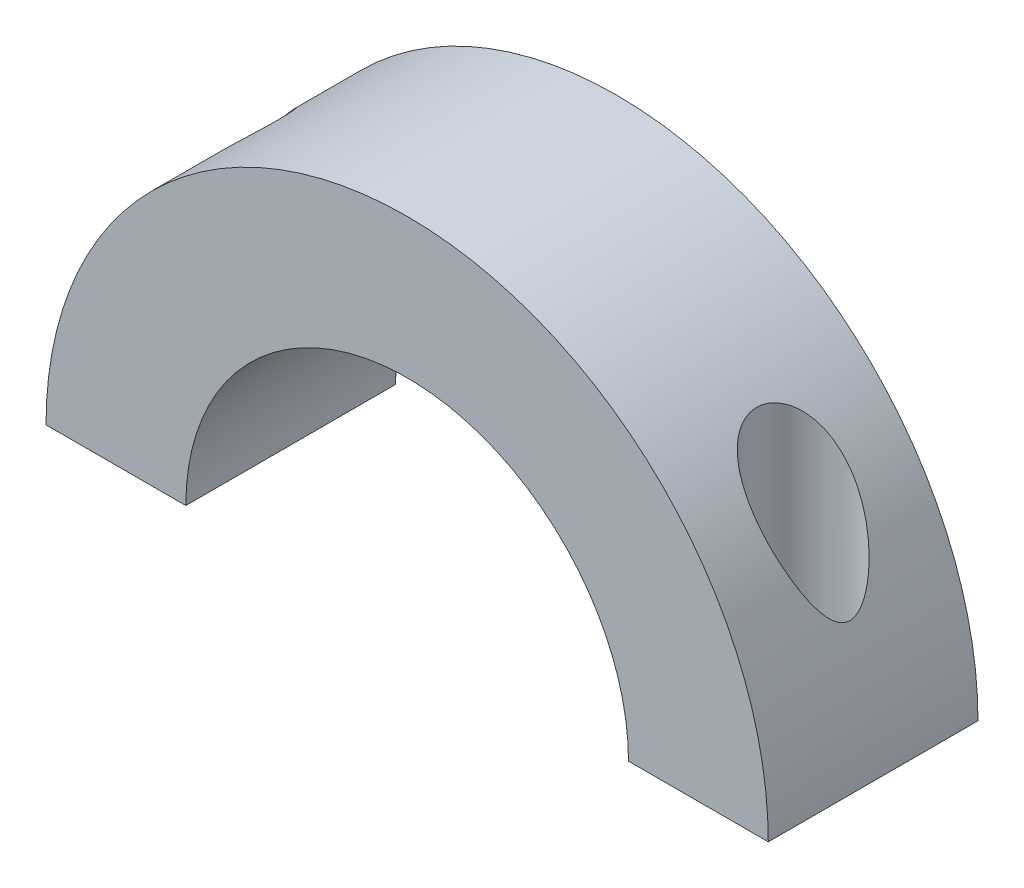
ISO-10303-21;
HEADER;
FILE_DESCRIPTION(('STEP AP214'),'2;1');
FILE_NAME('part.step','',(''),(''),'','','');
FILE_SCHEMA(('AUTOMOTIVE_DESIGN { 1 0 10303 214 1 1 1 1 }'));
ENDSEC;
DATA;
#1=APPLICATION_CONTEXT('core data for automotive mechanical design processes');
#2=APPLICATION_PROTOCOL_DEFINITION('international standard','automotive_design',2000,#1);
#3=PRODUCT_CONTEXT('',#1,'mechanical');
#4=PRODUCT('Part','Part','',(#3));
#5=PRODUCT_RELATED_PRODUCT_CATEGORY('part','',(#4));
#6=PRODUCT_DEFINITION_FORMATION('','',#4);
#7=PRODUCT_DEFINITION_CONTEXT('part definition',#1,'design');
#8=PRODUCT_DEFINITION('design','',#6,#7);
#9=PRODUCT_DEFINITION_SHAPE('','',#8);
#10=(LENGTH_UNIT() NAMED_UNIT(*) SI_UNIT(.MILLI.,.METRE.));
#11=(NAMED_UNIT(*) PLANE_ANGLE_UNIT() SI_UNIT($,.RADIAN.));
#12=(NAMED_UNIT(*) SI_UNIT($,.STERADIAN.) SOLID_ANGLE_UNIT());
#13=UNCERTAINTY_MEASURE_WITH_UNIT(LENGTH_MEASURE(1.E-05),#10,'distance_accuracy_value','');
#14=(GEOMETRIC_REPRESENTATION_CONTEXT(3) GLOBAL_UNCERTAINTY_ASSIGNED_CONTEXT((#13)) GLOBAL_UNIT_ASSIGNED_CONTEXT((#10,
#11,#12)) REPRESENTATION_CONTEXT('',''));
#15=CARTESIAN_POINT('',(0.,0.,0.));
#16=DIRECTION('',(0.,0.,1.));
#17=DIRECTION('',(1.,0.,0.));
#18=AXIS2_PLACEMENT_3D('',#15,#16,#17);
#19=CARTESIAN_POINT('',(0.,0.,18.));
#20=DIRECTION('',(0.,0.,-1.));
#21=DIRECTION('',(-1.,0.,0.));
#22=AXIS2_PLACEMENT_3D('',#19,#20,#21);
#23=CYLINDRICAL_SURFACE('',#22,31.);
#24=CARTESIAN_POINT('',(25.,18.3303027798234,5.));
#25=CARTESIAN_POINT('',(24.8440725378242,18.5429648104186,4.99999834693672));
#26=CARTESIAN_POINT('',(24.6853946071166,18.7536793176195,5.00910047007202));
#27=CARTESIAN_POINT('',(24.3635103532747,19.1699930019949,5.04763708695558));
#28=CARTESIAN_POINT('',(24.2003012248089,19.3755888537004,5.07708445890284));
#29=CARTESIAN_POINT('',(23.8712055274805,19.7796181922859,5.15883711268822));
#30=CARTESIAN_POINT('',(23.7053230027018,19.9780612525745,5.21111051308694));
#31=CARTESIAN_POINT('',(23.3731361141481,20.3656952329873,5.34143361783125));
#32=CARTESIAN_POINT('',(23.20683242597,20.5548962115987,5.41945454876341));
#33=CARTESIAN_POINT('',(22.8732083649563,20.9255795596352,5.60674166231151));
#34=CARTESIAN_POINT('',(22.7059526470021,21.1067841553644,5.71668547931498));
#35=CARTESIAN_POINT('',(22.3798764915757,21.4522103271162,5.97055561693543));
#36=CARTESIAN_POINT('',(22.2210449776457,21.6164544868569,6.1144358880528));
#37=CARTESIAN_POINT('',(21.9452834326933,21.8960348704812,6.41110341200045));
#38=CARTESIAN_POINT('',(21.8258350033741,22.0149303032896,6.55814933200775));
#39=CARTESIAN_POINT('',(21.6038806922158,22.2327791824141,6.87771171453206));
#40=CARTESIAN_POINT('',(21.5013555276024,22.3317553538167,7.05019875832245));
#41=CARTESIAN_POINT('',(21.3368258786018,22.488895074806,7.38471819177052));
#42=CARTESIAN_POINT('',(21.270834643445,22.5512204486291,7.54279461990126));
#43=CARTESIAN_POINT('',(21.1865840167894,22.6302923713222,7.7894453392909));
#44=CARTESIAN_POINT('',(21.1609508830841,22.6542521518156,7.87327891385435));
#45=CARTESIAN_POINT('',(21.1150084125697,22.6970793130105,8.04364758569689));
#46=CARTESIAN_POINT('',(21.0946968904875,22.7159487840975,8.13018155769337));
#47=CARTESIAN_POINT('',(21.0596650556057,22.7484303379167,8.30586070876304));
#48=CARTESIAN_POINT('',(21.0449763328409,22.7620127237202,8.39501769559748));
#49=CARTESIAN_POINT('',(21.0216368718112,22.7835694275095,8.57475225392739));
#50=CARTESIAN_POINT('',(21.01298352055,22.7915461724524,8.66532919326984));
#51=CARTESIAN_POINT('',(21.0018824398915,22.8017761272689,8.84719324817007));
#52=CARTESIAN_POINT('',(20.9994348123468,22.8040292432025,8.93848037535928));
#53=CARTESIAN_POINT('',(21.0007858657793,22.8027845349241,9.12094015222018));
#54=CARTESIAN_POINT('',(21.0045841419976,22.7992870833713,9.21211280892683));
#55=CARTESIAN_POINT('',(21.0241050532095,22.7812944617046,9.46892702003491));
#56=CARTESIAN_POINT('',(21.0471026480896,22.7600857772158,9.63364573545759));
#57=CARTESIAN_POINT('',(21.1123462585095,22.6995762098303,9.95561779082682));
#58=CARTESIAN_POINT('',(21.154592670378,22.6602749544117,10.1128709769863));
#59=CARTESIAN_POINT('',(21.2574047297385,22.5638610674473,10.4213430301116));
#60=CARTESIAN_POINT('',(21.3184984613775,22.5062332813956,10.572222921513));
#61=CARTESIAN_POINT('',(21.4552480430574,22.3759080444386,10.860161159053));
#62=CARTESIAN_POINT('',(21.5309112354643,22.3032029938288,10.9972124829047));
#63=CARTESIAN_POINT('',(21.7297051832038,22.1098749276034,11.3138538549968));
#64=CARTESIAN_POINT('',(21.8590029033316,21.9823029536339,11.4853426966256));
#65=CARTESIAN_POINT('',(22.1328165343368,21.7065952111084,11.7968696309203));
#66=CARTESIAN_POINT('',(22.2773639279527,21.5584166918757,11.9368407130362));
#67=CARTESIAN_POINT('',(22.5307469724867,21.2929216132307,12.1498349397655));
#68=CARTESIAN_POINT('',(22.6374598889793,21.179485498508,12.2304017610675));
#69=CARTESIAN_POINT('',(22.8534432528734,20.9462516628356,12.3777784364227));
#70=CARTESIAN_POINT('',(22.9627146983173,20.8264514354203,12.4445828189363));
#71=CARTESIAN_POINT('',(23.292428719303,20.4589970951531,12.6259109363354));
#72=CARTESIAN_POINT('',(23.5146885786972,20.2033750860338,12.7212837386909));
#73=CARTESIAN_POINT('',(23.9012495822696,19.7432855535363,12.8501070256378));
#74=CARTESIAN_POINT('',(24.0662577380225,19.5418489791005,12.8930475631604));
#75=CARTESIAN_POINT('',(24.392835276003,19.1326426677742,12.957150246706));
#76=CARTESIAN_POINT('',(24.5544029025615,18.9248698231181,12.9783015228917));
#77=CARTESIAN_POINT('',(24.8729512469319,18.5042186285861,13.0011769604055));
#78=CARTESIAN_POINT('',(25.0299220850632,18.2913308501605,13.0028619607851));
#79=CARTESIAN_POINT('',(25.3380524077325,17.8620527465157,12.9886707316841));
#80=CARTESIAN_POINT('',(25.4892124252819,17.6456627451462,12.9727961168973));
#81=CARTESIAN_POINT('',(25.8422296054431,17.1263561644747,12.91584291103));
#82=CARTESIAN_POINT('',(26.0411640175139,16.8222444985086,12.8674068112365));
#83=CARTESIAN_POINT('',(26.4258526443899,16.2112561150447,12.7427067761913));
#84=CARTESIAN_POINT('',(26.61159862285,15.9043778022229,12.6664256308028));
#85=CARTESIAN_POINT('',(26.9692661215757,15.2900276762251,12.4874130401547));
#86=CARTESIAN_POINT('',(27.1411818469765,14.9825556689762,12.3846705826004));
#87=CARTESIAN_POINT('',(27.3880367848129,14.5232813526927,12.2105102505075));
#88=CARTESIAN_POINT('',(27.4684665620087,14.3705501961828,12.1491335738614));
#89=CARTESIAN_POINT('',(27.6255832033342,14.0661458225791,12.0193878849399));
#90=CARTESIAN_POINT('',(27.7022706096807,13.9144724549722,11.9510198900777));
#91=CARTESIAN_POINT('',(27.850414686708,13.6154960433898,11.8081197580309));
#92=CARTESIAN_POINT('',(27.9219409000418,13.4681635816617,11.7337215543157));
#93=CARTESIAN_POINT('',(28.0610732389327,13.1758250070044,11.5769791358607));
#94=CARTESIAN_POINT('',(28.1286786266117,13.0308193356547,11.4946334331632));
#95=CARTESIAN_POINT('',(28.2593552135961,12.7449374941101,11.321280168168));
#96=CARTESIAN_POINT('',(28.3224448831377,12.6040460857226,11.2303119044256));
#97=CARTESIAN_POINT('',(28.4438663120481,12.327578678461,11.0378297024099));
#98=CARTESIAN_POINT('',(28.5022017083338,12.1919986585167,10.9363239628477));
#99=CARTESIAN_POINT('',(28.6006113784826,11.9589801465672,10.7448192374628));
#100=CARTESIAN_POINT('',(28.6418224364718,11.8598770194585,10.6574493157806));
#101=CARTESIAN_POINT('',(28.720231820849,11.6687168891738,10.4730709576842));
#102=CARTESIAN_POINT('',(28.757421144727,11.5766758226,10.3760417944902));
#103=CARTESIAN_POINT('',(28.8268657759834,11.4026605585022,10.169266597921));
#104=CARTESIAN_POINT('',(28.8590531639119,11.3208274924899,10.0593760047043));
#105=CARTESIAN_POINT('',(28.9155707301911,11.1756796573728,9.82615430841083));
#106=CARTESIAN_POINT('',(28.9399355750405,11.1122833050435,9.70288583826826));
#107=CARTESIAN_POINT('',(28.9700113795587,11.033561400031,9.49521432654502));
#108=CARTESIAN_POINT('',(28.979287761352,11.0091437440436,9.41481430886727));
#109=CARTESIAN_POINT('',(28.9929734471474,10.9730520141981,9.25080667322946));
#110=CARTESIAN_POINT('',(28.9973891047764,10.9613613047131,9.16720339073538));
#111=CARTESIAN_POINT('',(29.0008894385798,10.9520977118217,8.99874960139658));
#112=CARTESIAN_POINT('',(28.9999531572661,10.9545803292498,8.91389549097565));
#113=CARTESIAN_POINT('',(28.9928126671615,10.9734636330358,8.7459655470395));
#114=CARTESIAN_POINT('',(28.9866035945583,10.989877169767,8.66289142801338));
#115=CARTESIAN_POINT('',(28.9674601360707,11.0402505156072,8.48079665833224));
#116=CARTESIAN_POINT('',(28.9532525777798,11.0775192171032,8.38284336074106));
#117=CARTESIAN_POINT('',(28.919237296616,11.1660172741731,8.19451703488301));
#118=CARTESIAN_POINT('',(28.8994166144884,11.2172789258534,8.10416218299969));
#119=CARTESIAN_POINT('',(28.8587003859709,11.32157624914,7.94345845829553));
#120=CARTESIAN_POINT('',(28.8383649514229,11.3733073222404,7.87209734468336));
#121=CARTESIAN_POINT('',(28.7951897630161,11.4821815374236,7.73440262006494));
#122=CARTESIAN_POINT('',(28.7723480503192,11.5393289079158,7.6680730110124));
#123=CARTESIAN_POINT('',(28.7006732661923,11.7169778624988,7.47557649856878));
#124=CARTESIAN_POINT('',(28.6487574729051,11.8435131887706,7.35614918987176));
#125=CARTESIAN_POINT('',(28.5330200417647,12.1198875749852,7.11933024155927));
#126=CARTESIAN_POINT('',(28.4685184771309,12.2707695104618,7.00353758221036));
#127=CARTESIAN_POINT('',(28.3334413672911,12.5795294403764,6.78536491178613));
#128=CARTESIAN_POINT('',(28.2628589966746,12.7374151972862,6.68300030676903));
#129=CARTESIAN_POINT('',(28.1161929123091,13.0579818012823,6.48919514085868));
#130=CARTESIAN_POINT('',(28.0400928612868,13.2206759667743,6.39778934014514));
#131=CARTESIAN_POINT('',(27.8830304276541,13.548789504299,6.22479394543816));
#132=CARTESIAN_POINT('',(27.8020698523057,13.714207847016,6.1432007363591));
#133=CARTESIAN_POINT('',(27.642590915715,14.0326810048325,5.9954202934006));
#134=CARTESIAN_POINT('',(27.5644495169416,14.1855921143127,5.92851311548879));
#135=CARTESIAN_POINT('',(27.4044104901246,14.4923511440679,5.80168383894968));
#136=CARTESIAN_POINT('',(27.322512390096,14.646199179939,5.74176262139338));
#137=CARTESIAN_POINT('',(27.071206900841,15.108699370279,5.57201739925189));
#138=CARTESIAN_POINT('',(26.8962756016181,15.418132698593,5.47229182272182));
#139=CARTESIAN_POINT('',(26.5331113110949,16.0350168246167,5.3000317660696));
#140=CARTESIAN_POINT('',(26.3449312835905,16.3424706904497,5.22739559611764));
#141=CARTESIAN_POINT('',(25.9554713292459,16.9541941120373,5.11048016307496));
#142=CARTESIAN_POINT('',(25.7542047637622,17.258466558609,5.06617246232675));
#143=CARTESIAN_POINT('',(25.4579899906645,17.6894169184605,5.02529400580469));
#144=CARTESIAN_POINT('',(25.367929505092,17.8183312891227,5.01591098889551));
#145=CARTESIAN_POINT('',(25.1855761652774,18.0751648412524,5.00326001273104));
#146=CARTESIAN_POINT('',(25.0932802477746,18.203082297752,5.00000098890952));
#147=CARTESIAN_POINT('',(25.,18.3303027798234,5.));
#148=B_SPLINE_CURVE_WITH_KNOTS('',3,(#24,#25,#26,#27,#28,#29,#30,#31,#32,#33,#34,#35,#36,#37,
#38,#39,#40,#41,#42,#43,#44,#45,#46,#47,#48,#49,#50,#51,#52,#53,#54,#55,#56,#57,#58,#59,#60,#61,
#62,#63,#64,#65,#66,#67,#68,#69,#70,#71,#72,#73,#74,#75,#76,#77,#78,#79,#80,#81,#82,#83,#84,#85,
#86,#87,#88,#89,#90,#91,#92,#93,#94,#95,#96,#97,#98,#99,#100,#101,#102,#103,#104,#105,#106,#107,
#108,#109,#110,#111,#112,#113,#114,#115,#116,#117,#118,#119,#120,#121,#122,#123,#124,#125,#126,
#127,#128,#129,#130,#131,#132,#133,#134,#135,#136,#137,#138,#139,#140,#141,#142,#143,#144,#145,
#146,#147),.UNSPECIFIED.,.T.,.F.,(4,2,2,2,2,2,2,2,2,2,2,2,2,2,2,2,2,2,2,2,2,2,2,2,2,2,2,2,2,2,2,
2,2,2,2,2,2,2,2,2,2,2,2,2,2,2,2,2,2,2,2,2,2,2,2,2,2,2,2,2,2,4),(0.,0.790982026665341,
1.58246519085586,2.3728463976113,3.16234731079748,3.97001435782794,4.77659169646046,
5.44509121188749,6.11282368485088,6.65719215637989,6.92954440227762,7.20178463319865,
7.47553266975358,7.74916211421162,8.02279604963432,8.2964122532093,8.79685617324497,
9.2973103977667,9.81330378182374,10.3295578876042,11.074837292708,11.821686596275,
12.3470386443482,12.872599155525,13.9241231966679,14.714932054403,15.5061352259673,
16.2989298105058,17.0916514997062,18.1899983606902,19.2890252275516,20.3885102130276,
20.9379776172692,21.4873651736263,22.026811075752,22.5663581714254,23.1035547119385,
23.640336374118,24.0551040654142,24.4707817769852,24.8916861698609,25.3106986704149,
25.5633321208566,25.8156349514737,26.0689264418514,26.3224518315203,26.6379650876063,
26.9542128055675,27.2251858610018,27.4963722307653,28.0396630018439,28.6413578053576,
29.2437370079344,29.8479789954113,30.4519976859144,31.0046955734122,31.5574630920669,
32.6636297708956,33.7656012307763,34.8664647276887,35.3389638153962,35.8121517862837),.UNSPECIFIED.);
#149=CARTESIAN_POINT('',(25.,18.3303027798234,5.));
#150=VERTEX_POINT('',#149);
#151=EDGE_CURVE('E126',#150,#150,#148,.T.);
#152=ORIENTED_EDGE('',*,*,#151,.F.);
#153=EDGE_LOOP('',(#152));
#154=FACE_BOUND('',#153,.T.);
#155=CARTESIAN_POINT('',(0.,0.,0.));
#156=DIRECTION('',(0.,0.,1.));
#157=DIRECTION('',(1.,0.,0.));
#158=AXIS2_PLACEMENT_3D('',#155,#156,#157);
#159=CIRCLE('',#158,31.);
#160=CARTESIAN_POINT('',(31.,0.,0.));
#161=VERTEX_POINT('',#160);
#162=CARTESIAN_POINT('',(-31.,0.,0.));
#163=VERTEX_POINT('',#162);
#164=EDGE_CURVE('E80',#161,#163,#159,.T.);
#165=ORIENTED_EDGE('',*,*,#164,.T.);
#166=DIRECTION('',(0.,0.,-1.));
#167=VECTOR('',#166,1.);
#168=CARTESIAN_POINT('',(-31.,0.,18.));
#169=LINE('',#168,#167);
#170=CARTESIAN_POINT('',(-31.,0.,18.));
#171=VERTEX_POINT('',#170);
#172=EDGE_CURVE('E103',#171,#163,#169,.T.);
#173=ORIENTED_EDGE('',*,*,#172,.F.);
#174=CARTESIAN_POINT('',(0.,0.,18.));
#175=DIRECTION('',(0.,0.,1.));
#176=DIRECTION('',(1.,0.,0.));
#177=AXIS2_PLACEMENT_3D('',#174,#175,#176);
#178=CIRCLE('',#177,31.);
#179=CARTESIAN_POINT('',(31.,0.,18.));
#180=VERTEX_POINT('',#179);
#181=EDGE_CURVE('E96',#180,#171,#178,.T.);
#182=ORIENTED_EDGE('',*,*,#181,.F.);
#183=DIRECTION('',(0.,0.,-1.));
#184=VECTOR('',#183,1.);
#185=CARTESIAN_POINT('',(31.,0.,18.));
#186=LINE('',#185,#184);
#187=EDGE_CURVE('E54',#180,#161,#186,.T.);
#188=ORIENTED_EDGE('',*,*,#187,.T.);
#189=EDGE_LOOP('',(#165,#173,#182,#188));
#190=FACE_BOUND('',#189,.T.);
#191=CARTESIAN_POINT('',(-24.16598216649,19.4166244730872,5.));
#192=CARTESIAN_POINT('',(-24.351459982444,19.1857763055428,4.9999977470237));
#193=CARTESIAN_POINT('',(-24.5336866454202,18.9521839318079,5.01287682800525));
#194=CARTESIAN_POINT('',(-24.890314989705,18.4813312998595,5.06200774164106));
#195=CARTESIAN_POINT('',(-25.0647094183086,18.2440679048364,5.0982807786413));
#196=CARTESIAN_POINT('',(-25.4054425578204,17.7665383248076,5.19275339155576));
#197=CARTESIAN_POINT('',(-25.5717428602218,17.5262635608078,5.25104781086503));
#198=CARTESIAN_POINT('',(-25.8947367500366,17.0454224925855,5.38859798717234));
#199=CARTESIAN_POINT('',(-26.0514348424268,16.8048563799196,5.46784382040384));
#200=CARTESIAN_POINT('',(-26.3185954026076,16.3822565571398,5.62594225587594));
#201=CARTESIAN_POINT('',(-26.4311882046747,16.1999142950426,5.70040262545059));
#202=CARTESIAN_POINT('',(-26.6501560765403,15.8371094325047,5.86194328941728));
#203=CARTESIAN_POINT('',(-26.7565322809416,15.6566464940372,5.94902127078732));
#204=CARTESIAN_POINT('',(-26.9621650781593,15.2997996023368,6.13632678484046));
#205=CARTESIAN_POINT('',(-27.0614519458419,15.1234007929469,6.23649249641861));
#206=CARTESIAN_POINT('',(-27.2526939621316,14.7759897435015,6.45186900353611));
#207=CARTESIAN_POINT('',(-27.3446550533936,14.6049732069141,6.56706740025887));
#208=CARTESIAN_POINT('',(-27.500284145164,14.3092866376984,6.78725204606429));
#209=CARTESIAN_POINT('',(-27.565653290644,14.1828680113124,6.88867471631209));
#210=CARTESIAN_POINT('',(-27.6904895267,13.9375637188405,7.10436227762089));
#211=CARTESIAN_POINT('',(-27.7499445688463,13.818693601974,7.2186524128131));
#212=CARTESIAN_POINT('',(-27.8335924840073,13.6490000712008,7.40212792009776));
#213=CARTESIAN_POINT('',(-27.8606972664056,13.5935668739726,7.46570866816475));
#214=CARTESIAN_POINT('',(-27.912557109283,13.4867598661983,7.59708134427529));
#215=CARTESIAN_POINT('',(-27.9373115451441,13.4353871353491,7.6648743838845));
#216=CARTESIAN_POINT('',(-28.0072529275309,13.2892914424968,7.87470783620945));
#217=CARTESIAN_POINT('',(-28.0484043780777,13.2020059614487,8.0238052887788));
#218=CARTESIAN_POINT('',(-28.1006001916007,13.0903930845088,8.27368697332494));
#219=CARTESIAN_POINT('',(-28.1170271422485,13.0550280516182,8.36840580835516));
#220=CARTESIAN_POINT('',(-28.1432307478918,12.9984435456349,8.56287468840668));
#221=CARTESIAN_POINT('',(-28.1530164841197,12.9772047570365,8.66261766196399));
#222=CARTESIAN_POINT('',(-28.1650148478476,12.9511455033286,8.86543520440432));
#223=CARTESIAN_POINT('',(-28.1671758441725,12.9464369744806,8.96852773422567));
#224=CARTESIAN_POINT('',(-28.1635202298318,12.9543869470343,9.17391713194582));
#225=CARTESIAN_POINT('',(-28.1577005238219,12.9670521869157,9.27621367563994));
#226=CARTESIAN_POINT('',(-28.1394526943214,13.0065988224874,9.46931748414982));
#227=CARTESIAN_POINT('',(-28.1275466359589,13.0323563398932,9.56041420375025));
#228=CARTESIAN_POINT('',(-28.0983974289513,13.0950854410295,9.73769365037423));
#229=CARTESIAN_POINT('',(-28.0811520608721,13.1320616880121,9.8238743162271));
#230=CARTESIAN_POINT('',(-28.0278256550743,13.2456504366736,10.0528657019213));
#231=CARTESIAN_POINT('',(-27.9872748752792,13.3312889916972,10.1901253986661));
#232=CARTESIAN_POINT('',(-27.8968117705954,13.5195743145886,10.4490883733575));
#233=CARTESIAN_POINT('',(-27.8468649786718,13.6222835351636,10.5707315099691));
#234=CARTESIAN_POINT('',(-27.742385029349,13.833777866268,10.7955481105867));
#235=CARTESIAN_POINT('',(-27.6881424355522,13.9421101282588,10.8992917503522));
#236=CARTESIAN_POINT('',(-27.574541663241,14.1654644067697,11.0963463136527));
#237=CARTESIAN_POINT('',(-27.5151788045691,14.2804925117023,11.1896475094866));
#238=CARTESIAN_POINT('',(-27.3920476064825,14.515279537846,11.3673173356525));
#239=CARTESIAN_POINT('',(-27.3282724927942,14.6350456070405,11.4516717031486));
#240=CARTESIAN_POINT('',(-27.1968644427784,14.8778234871999,11.612379355549));
#241=CARTESIAN_POINT('',(-27.1292302058108,15.0008363848463,11.688729918039));
#242=CARTESIAN_POINT('',(-26.9953631289986,15.2403358362484,11.8290142388203));
#243=CARTESIAN_POINT('',(-26.9293705039873,15.3566672925664,11.8934444688025));
#244=CARTESIAN_POINT('',(-26.7945242387998,15.5907580231515,12.0164697822743));
#245=CARTESIAN_POINT('',(-26.7256701820898,15.7085175035141,12.0750640119809));
#246=CARTESIAN_POINT('',(-26.5149458640422,16.0634143036886,12.2426299189148));
#247=CARTESIAN_POINT('',(-26.3689693383108,16.3020696594836,12.3433271091857));
#248=CARTESIAN_POINT('',(-26.0666257377253,16.7812852139693,12.5240024083064));
#249=CARTESIAN_POINT('',(-25.9102385247553,17.021848261992,12.6039388034299));
#250=CARTESIAN_POINT('',(-25.5879601573769,17.5025711033233,12.7428264748577));
#251=CARTESIAN_POINT('',(-25.4220719430646,17.7427309979617,12.8017842027355));
#252=CARTESIAN_POINT('',(-25.07540810916,18.2295446330284,12.899552061055));
#253=CARTESIAN_POINT('',(-24.894314201291,18.4761300552574,12.9375815014964));
#254=CARTESIAN_POINT('',(-24.5234705722404,18.9655919680818,12.9883880906239));
#255=CARTESIAN_POINT('',(-24.3337174371142,19.2084669445556,13.0011551899528));
#256=CARTESIAN_POINT('',(-23.947845193266,19.6874288789609,12.9986860765023));
#257=CARTESIAN_POINT('',(-23.7517556187169,19.9235397323925,12.9835653210917));
#258=CARTESIAN_POINT('',(-23.3548665299443,20.3873291495201,12.9220362758653));
#259=CARTESIAN_POINT('',(-23.154072390439,20.6150166360779,12.8756621556481));
#260=CARTESIAN_POINT('',(-22.747319133466,21.0630625332288,12.7461703850501));
#261=CARTESIAN_POINT('',(-22.5413324191771,21.2832129052749,12.6624010928102));
#262=CARTESIAN_POINT('',(-22.133561836013,21.7069467123187,12.4527825749949));
#263=CARTESIAN_POINT('',(-21.9317738390601,21.9105470531066,12.3269769783563));
#264=CARTESIAN_POINT('',(-21.5789214282078,22.257564757766,12.057193405474));
#265=CARTESIAN_POINT('',(-21.4255908197143,22.4050087419028,11.9214261386142));
#266=CARTESIAN_POINT('',(-21.1340140187977,22.6802442393164,11.6175147494639));
#267=CARTESIAN_POINT('',(-20.9957477969682,22.8080619423829,11.4494144603686));
#268=CARTESIAN_POINT('',(-20.7688176674355,23.0146644290687,11.1191124849986));
#269=CARTESIAN_POINT('',(-20.6758088666085,23.0981230696727,10.9628777943368));
#270=CARTESIAN_POINT('',(-20.5510204957586,23.2090212192439,10.7148329792919));
#271=CARTESIAN_POINT('',(-20.5118671423805,23.2436154491114,10.6298363877763));
#272=CARTESIAN_POINT('',(-20.4390637921129,23.3076601037962,10.4556694024662));
#273=CARTESIAN_POINT('',(-20.4054114070913,23.3371127611007,10.366500841587));
#274=CARTESIAN_POINT('',(-20.3439433206841,23.3907171630608,10.1837995609823));
#275=CARTESIAN_POINT('',(-20.3161743937788,23.4148264922522,10.0902386009332));
#276=CARTESIAN_POINT('',(-20.2673392013976,23.4571099332221,9.90011593247896));
#277=CARTESIAN_POINT('',(-20.2462696597526,23.4752869461687,9.80355571622461));
#278=CARTESIAN_POINT('',(-20.2112496253358,23.5054445646951,9.60822159920275));
#279=CARTESIAN_POINT('',(-20.1972973919978,23.5174266852702,9.50944824584094));
#280=CARTESIAN_POINT('',(-20.1768055147533,23.5350101748849,9.31057707191597));
#281=CARTESIAN_POINT('',(-20.1702649658048,23.5406123229845,9.21047941457428));
#282=CARTESIAN_POINT('',(-20.1650648024756,23.5450667486955,9.02184922433311));
#283=CARTESIAN_POINT('',(-20.1655613288061,23.5446417716042,8.93335531069565));
#284=CARTESIAN_POINT('',(-20.1724081277657,23.5387759051497,8.75673193283471));
#285=CARTESIAN_POINT('',(-20.1787602457942,23.5333334345152,8.6686025923026));
#286=CARTESIAN_POINT('',(-20.1972104259882,23.517500697288,8.49344462288934));
#287=CARTESIAN_POINT('',(-20.2093052943785,23.5071131808265,8.40641540976772));
#288=CARTESIAN_POINT('',(-20.239032185549,23.4815236913797,8.23401566827702));
#289=CARTESIAN_POINT('',(-20.2566663169068,23.4663198850055,8.14864578471144));
#290=CARTESIAN_POINT('',(-20.3165450465528,23.4145419802436,7.89981835331766));
#291=CARTESIAN_POINT('',(-20.3662343673235,23.3714047968202,7.73941651021758));
#292=CARTESIAN_POINT('',(-20.4829840953405,23.2691499920852,7.43065163886361));
#293=CARTESIAN_POINT('',(-20.5500484800543,23.2100287115884,7.28229137737229));
#294=CARTESIAN_POINT('',(-20.7058262832204,23.0712081528713,6.98552347613903));
#295=CARTESIAN_POINT('',(-20.7960323452603,22.9900440047067,6.83858890375657));
#296=CARTESIAN_POINT('',(-20.9895145908733,22.8135373762308,6.56310495814283));
#297=CARTESIAN_POINT('',(-21.0927981354378,22.7181869054569,6.43456602684836));
#298=CARTESIAN_POINT('',(-21.365683769381,22.4623746909541,6.13318157137431));
#299=CARTESIAN_POINT('',(-21.541567498395,22.2940670885589,5.97264986714832));
#300=CARTESIAN_POINT('',(-21.9050455133518,21.9370511333917,5.69226184274967));
#301=CARTESIAN_POINT('',(-22.0926704322522,21.7482883881021,5.57251766223855));
#302=CARTESIAN_POINT('',(-22.4166563284998,21.4133380953205,5.39958095740788));
#303=CARTESIAN_POINT('',(-22.5520118482716,21.270786420597,5.33716389452306));
#304=CARTESIAN_POINT('',(-22.8231188366589,20.9796279594816,5.22932180958912));
#305=CARTESIAN_POINT('',(-22.9588704752698,20.8310180467002,5.18390568728609));
#306=CARTESIAN_POINT('',(-23.2291820758383,20.5291536345617,5.10871847646581));
#307=CARTESIAN_POINT('',(-23.3637429633691,20.3759032452576,5.07893394839536));
#308=CARTESIAN_POINT('',(-23.6307468942809,20.0656338550706,5.03366077263357));
#309=CARTESIAN_POINT('',(-23.7631909210004,19.908616694052,5.01816528573509));
#310=CARTESIAN_POINT('',(-23.9398743941581,19.6948613028834,5.00613355514682));
#311=CARTESIAN_POINT('',(-23.9853704154465,19.6394284180372,5.00382235007235));
#312=CARTESIAN_POINT('',(-24.0759683969862,19.5282586665425,5.00075634579904));
#313=CARTESIAN_POINT('',(-24.1210705920789,19.4725220185753,5.00000054553539));
#314=CARTESIAN_POINT('',(-24.16598216649,19.4166244730872,5.));
#315=B_SPLINE_CURVE_WITH_KNOTS('',3,(#191,#192,#193,#194,#195,#196,#197,#198,#199,#200,#201,
#202,#203,#204,#205,#206,#207,#208,#209,#210,#211,#212,#213,#214,#215,#216,#217,#218,#219,#220,
#221,#222,#223,#224,#225,#226,#227,#228,#229,#230,#231,#232,#233,#234,#235,#236,#237,#238,#239,
#240,#241,#242,#243,#244,#245,#246,#247,#248,#249,#250,#251,#252,#253,#254,#255,#256,#257,#258,
#259,#260,#261,#262,#263,#264,#265,#266,#267,#268,#269,#270,#271,#272,#273,#274,#275,#276,#277,
#278,#279,#280,#281,#282,#283,#284,#285,#286,#287,#288,#289,#290,#291,#292,#293,#294,#295,#296,
#297,#298,#299,#300,#301,#302,#303,#304,#305,#306,#307,#308,#309,#310,#311,#312,#313,#314),
.UNSPECIFIED.,.T.,.F.,(4,2,2,2,2,2,2,2,2,2,2,2,2,2,2,2,2,2,2,2,2,2,2,2,2,2,2,2,2,2,2,2,2,2,2,2,
2,2,2,2,2,2,2,2,2,2,2,2,2,2,2,2,2,2,2,2,2,2,2,2,2,4),(0.,0.888320477955486,1.77744726579005,
2.67044789890641,3.5630263121892,4.24324231677625,4.92333378363188,5.60032166857732,
6.27675466843415,6.80051353876571,7.32531846887629,7.59090482804517,7.85656157191686,
8.38523576978255,8.69148140963794,8.99730743922108,9.30520044695393,9.61321290588561,
9.89838405881898,10.1836739106714,10.6811384361684,11.1804646907517,11.6582638300465,
12.136504424148,12.6154963085256,13.0946505921566,13.5398568698344,13.9851281839931,
14.8760551029331,15.7687585091509,16.6611871443626,17.5849720944976,18.5091244523883,
19.4294593502514,20.3487896661275,21.2848064425337,22.2198547412966,22.9741963298433,
23.7275223908521,24.3250865609967,24.6240826304617,24.92294855021,25.2241080597843,
25.5251200674147,25.8260584260263,26.1269600330437,26.3921186235752,26.6573608078474,
26.9224556527022,27.1876515311745,27.7053895204026,28.2232461341373,28.7927869672593,
29.3626498179568,30.2326077918397,31.1049386455039,31.7228952572966,32.3411749095379,
32.9589221099209,33.5763734823856,33.7916098586196,34.0067076644751),.UNSPECIFIED.);
#316=CARTESIAN_POINT('',(-24.16598216649,19.4166244730872,5.));
#317=VERTEX_POINT('',#316);
#318=EDGE_CURVE('E43',#317,#317,#315,.T.);
#319=ORIENTED_EDGE('',*,*,#318,.F.);
#320=EDGE_LOOP('',(#319));
#321=FACE_BOUND('',#320,.T.);
#322=ADVANCED_FACE('F39',(#154,#190,#321),#23,.T.);
#323=CARTESIAN_POINT('',(-24.16598216649,31.,9.));
#324=DIRECTION('',(0.,-1.,0.));
#325=DIRECTION('',(0.,0.,-1.));
#326=AXIS2_PLACEMENT_3D('',#323,#324,#325);
#327=CYLINDRICAL_SURFACE('',#326,2.);
#328=CARTESIAN_POINT('',(-24.16598216649,0.,9.));
#329=DIRECTION('',(0.,-1.,0.));
#330=DIRECTION('',(0.,0.,-1.));
#331=AXIS2_PLACEMENT_3D('',#328,#329,#330);
#332=CIRCLE('',#331,2.);
#333=CARTESIAN_POINT('',(-24.16598216649,0.,7.));
#334=VERTEX_POINT('',#333);
#335=EDGE_CURVE('E114',#334,#334,#332,.T.);
#336=ORIENTED_EDGE('',*,*,#335,.T.);
#337=EDGE_LOOP('',(#336));
#338=FACE_BOUND('',#337,.T.);
#339=CARTESIAN_POINT('',(-24.16598216649,6.,9.));
#340=DIRECTION('',(0.,1.,0.));
#341=DIRECTION('',(0.,0.,1.));
#342=AXIS2_PLACEMENT_3D('',#339,#340,#341);
#343=CIRCLE('',#342,2.);
#344=CARTESIAN_POINT('',(-24.16598216649,6.,11.));
#345=VERTEX_POINT('',#344);
#346=EDGE_CURVE('E123',#345,#345,#343,.F.);
#347=ORIENTED_EDGE('',*,*,#346,.F.);
#348=EDGE_LOOP('',(#347));
#349=FACE_BOUND('',#348,.T.);
#350=ADVANCED_FACE('F142',(#338,#349),#327,.F.);
#351=CARTESIAN_POINT('',(25.,31.,9.));
#352=DIRECTION('',(0.,-1.,0.));
#353=DIRECTION('',(0.,0.,-1.));
#354=AXIS2_PLACEMENT_3D('',#351,#352,#353);
#355=CYLINDRICAL_SURFACE('',#354,2.);
#356=CARTESIAN_POINT('',(25.,0.,9.));
#357=DIRECTION('',(0.,-1.,0.));
#358=DIRECTION('',(0.,0.,-1.));
#359=AXIS2_PLACEMENT_3D('',#356,#357,#358);
#360=CIRCLE('',#359,2.);
#361=CARTESIAN_POINT('',(25.,0.,7.));
#362=VERTEX_POINT('',#361);
#363=EDGE_CURVE('E217',#362,#362,#360,.T.);
#364=ORIENTED_EDGE('',*,*,#363,.T.);
#365=EDGE_LOOP('',(#364));
#366=FACE_BOUND('',#365,.T.);
#367=CARTESIAN_POINT('',(25.,6.,9.));
#368=DIRECTION('',(0.,1.,0.));
#369=DIRECTION('',(0.,0.,1.));
#370=AXIS2_PLACEMENT_3D('',#367,#368,#369);
#371=CIRCLE('',#370,2.);
#372=CARTESIAN_POINT('',(25.,6.,11.));
#373=VERTEX_POINT('',#372);
#374=EDGE_CURVE('E120',#373,#373,#371,.F.);
#375=ORIENTED_EDGE('',*,*,#374,.F.);
#376=EDGE_LOOP('',(#375));
#377=FACE_BOUND('',#376,.T.);
#378=ADVANCED_FACE('F145',(#366,#377),#355,.F.);
#379=CARTESIAN_POINT('',(0.,0.,18.));
#380=DIRECTION('',(0.,0.,-1.));
#381=DIRECTION('',(-1.,0.,0.));
#382=AXIS2_PLACEMENT_3D('',#379,#380,#381);
#383=CYLINDRICAL_SURFACE('',#382,19.);
#384=CARTESIAN_POINT('',(0.,0.,0.));
#385=DIRECTION('',(0.,0.,-1.));
#386=DIRECTION('',(1.,0.,0.));
#387=AXIS2_PLACEMENT_3D('',#384,#385,#386);
#388=CIRCLE('',#387,19.);
#389=CARTESIAN_POINT('',(-19.,0.,0.));
#390=VERTEX_POINT('',#389);
#391=CARTESIAN_POINT('',(19.,0.,0.));
#392=VERTEX_POINT('',#391);
#393=EDGE_CURVE('E111',#390,#392,#388,.T.);
#394=ORIENTED_EDGE('',*,*,#393,.T.);
#395=DIRECTION('',(0.,0.,-1.));
#396=VECTOR('',#395,1.);
#397=CARTESIAN_POINT('',(19.,0.,18.));
#398=LINE('',#397,#396);
#399=CARTESIAN_POINT('',(19.,0.,18.));
#400=VERTEX_POINT('',#399);
#401=EDGE_CURVE('E11',#400,#392,#398,.T.);
#402=ORIENTED_EDGE('',*,*,#401,.F.);
#403=CARTESIAN_POINT('',(0.,0.,18.));
#404=DIRECTION('',(0.,0.,-1.));
#405=DIRECTION('',(1.,0.,0.));
#406=AXIS2_PLACEMENT_3D('',#403,#404,#405);
#407=CIRCLE('',#406,19.);
#408=CARTESIAN_POINT('',(-19.,0.,18.));
#409=VERTEX_POINT('',#408);
#410=EDGE_CURVE('E98',#409,#400,#407,.T.);
#411=ORIENTED_EDGE('',*,*,#410,.F.);
#412=DIRECTION('',(0.,0.,-1.));
#413=VECTOR('',#412,1.);
#414=CARTESIAN_POINT('',(-19.,0.,18.));
#415=LINE('',#414,#413);
#416=EDGE_CURVE('E107',#409,#390,#415,.T.);
#417=ORIENTED_EDGE('',*,*,#416,.T.);
#418=EDGE_LOOP('',(#394,#402,#411,#417));
#419=FACE_BOUND('',#418,.T.);
#420=ADVANCED_FACE('F41',(#419),#383,.F.);
#421=CARTESIAN_POINT('',(19.,0.,18.));
#422=DIRECTION('',(0.,1.,0.));
#423=DIRECTION('',(0.,0.,1.));
#424=AXIS2_PLACEMENT_3D('',#421,#422,#423);
#425=PLANE('',#424);
#426=ORIENTED_EDGE('',*,*,#363,.F.);
#427=EDGE_LOOP('',(#426));
#428=FACE_BOUND('',#427,.T.);
#429=DIRECTION('',(1.,0.,0.));
#430=VECTOR('',#429,1.);
#431=CARTESIAN_POINT('',(19.,0.,0.));
#432=LINE('',#431,#430);
#433=EDGE_CURVE('E102',#392,#161,#432,.T.);
#434=ORIENTED_EDGE('',*,*,#433,.T.);
#435=ORIENTED_EDGE('',*,*,#187,.F.);
#436=DIRECTION('',(1.,0.,0.));
#437=VECTOR('',#436,1.);
#438=CARTESIAN_POINT('',(19.,0.,18.));
#439=LINE('',#438,#437);
#440=EDGE_CURVE('E93',#400,#180,#439,.T.);
#441=ORIENTED_EDGE('',*,*,#440,.F.);
#442=ORIENTED_EDGE('',*,*,#401,.T.);
#443=EDGE_LOOP('',(#434,#435,#441,#442));
#444=FACE_BOUND('',#443,.T.);
#445=ADVANCED_FACE('F101',(#428,#444),#425,.F.);
#446=CARTESIAN_POINT('',(-31.,0.,18.));
#447=DIRECTION('',(0.,1.,0.));
#448=DIRECTION('',(0.,0.,1.));
#449=AXIS2_PLACEMENT_3D('',#446,#447,#448);
#450=PLANE('',#449);
#451=ORIENTED_EDGE('',*,*,#335,.F.);
#452=EDGE_LOOP('',(#451));
#453=FACE_BOUND('',#452,.T.);
#454=DIRECTION('',(1.,0.,0.));
#455=VECTOR('',#454,1.);
#456=CARTESIAN_POINT('',(-31.,0.,0.));
#457=LINE('',#456,#455);
#458=EDGE_CURVE('E86',#163,#390,#457,.T.);
#459=ORIENTED_EDGE('',*,*,#458,.T.);
#460=ORIENTED_EDGE('',*,*,#416,.F.);
#461=DIRECTION('',(1.,0.,0.));
#462=VECTOR('',#461,1.);
#463=CARTESIAN_POINT('',(-31.,0.,18.));
#464=LINE('',#463,#462);
#465=EDGE_CURVE('E63',#171,#409,#464,.T.);
#466=ORIENTED_EDGE('',*,*,#465,.F.);
#467=ORIENTED_EDGE('',*,*,#172,.T.);
#468=EDGE_LOOP('',(#459,#460,#466,#467));
#469=FACE_BOUND('',#468,.T.);
#470=ADVANCED_FACE('F152',(#453,#469),#450,.F.);
#471=CARTESIAN_POINT('',(0.,0.,18.));
#472=DIRECTION('',(0.,0.,1.));
#473=DIRECTION('',(1.,0.,0.));
#474=AXIS2_PLACEMENT_3D('',#471,#472,#473);
#475=PLANE('',#474);
#476=ORIENTED_EDGE('',*,*,#410,.T.);
#477=ORIENTED_EDGE('',*,*,#440,.T.);
#478=ORIENTED_EDGE('',*,*,#181,.T.);
#479=ORIENTED_EDGE('',*,*,#465,.T.);
#480=EDGE_LOOP('',(#476,#477,#478,#479));
#481=FACE_BOUND('',#480,.T.);
#482=ADVANCED_FACE('F94',(#481),#475,.T.);
#483=CARTESIAN_POINT('',(0.,0.,0.));
#484=DIRECTION('',(0.,0.,1.));
#485=DIRECTION('',(1.,0.,0.));
#486=AXIS2_PLACEMENT_3D('',#483,#484,#485);
#487=PLANE('',#486);
#488=ORIENTED_EDGE('',*,*,#393,.F.);
#489=ORIENTED_EDGE('',*,*,#458,.F.);
#490=ORIENTED_EDGE('',*,*,#164,.F.);
#491=ORIENTED_EDGE('',*,*,#433,.F.);
#492=EDGE_LOOP('',(#488,#489,#490,#491));
#493=FACE_BOUND('',#492,.T.);
#494=ADVANCED_FACE('F140',(#493),#487,.F.);
#495=CARTESIAN_POINT('',(25.,31.,9.));
#496=DIRECTION('',(0.,-1.,0.));
#497=DIRECTION('',(0.,0.,-1.));
#498=AXIS2_PLACEMENT_3D('',#495,#496,#497);
#499=CYLINDRICAL_SURFACE('',#498,4.);
#500=CARTESIAN_POINT('',(25.,6.,9.));
#501=DIRECTION('',(0.,1.,0.));
#502=DIRECTION('',(0.,0.,1.));
#503=AXIS2_PLACEMENT_3D('',#500,#501,#502);
#504=CIRCLE('',#503,4.);
#505=CARTESIAN_POINT('',(25.,6.,13.));
#506=VERTEX_POINT('',#505);
#507=EDGE_CURVE('E210',#506,#506,#504,.T.);
#508=ORIENTED_EDGE('',*,*,#507,.F.);
#509=EDGE_LOOP('',(#508));
#510=FACE_BOUND('',#509,.T.);
#511=ORIENTED_EDGE('',*,*,#151,.T.);
#512=EDGE_LOOP('',(#511));
#513=FACE_BOUND('',#512,.T.);
#514=ADVANCED_FACE('F134',(#510,#513),#499,.F.);
#515=CARTESIAN_POINT('',(25.,6.,9.));
#516=DIRECTION('',(0.,1.,0.));
#517=DIRECTION('',(0.,0.,1.));
#518=AXIS2_PLACEMENT_3D('',#515,#516,#517);
#519=PLANE('',#518);
#520=ORIENTED_EDGE('',*,*,#507,.T.);
#521=EDGE_LOOP('',(#520));
#522=FACE_BOUND('',#521,.T.);
#523=ORIENTED_EDGE('',*,*,#374,.T.);
#524=EDGE_LOOP('',(#523));
#525=FACE_BOUND('',#524,.T.);
#526=ADVANCED_FACE('F139',(#522,#525),#519,.T.);
#527=CARTESIAN_POINT('',(-24.16598216649,31.,9.));
#528=DIRECTION('',(0.,-1.,0.));
#529=DIRECTION('',(0.,0.,-1.));
#530=AXIS2_PLACEMENT_3D('',#527,#528,#529);
#531=CYLINDRICAL_SURFACE('',#530,4.);
#532=CARTESIAN_POINT('',(-24.16598216649,6.,9.));
#533=DIRECTION('',(0.,1.,0.));
#534=DIRECTION('',(0.,0.,1.));
#535=AXIS2_PLACEMENT_3D('',#532,#533,#534);
#536=CIRCLE('',#535,4.);
#537=CARTESIAN_POINT('',(-24.16598216649,6.,13.));
#538=VERTEX_POINT('',#537);
#539=EDGE_CURVE('E124',#538,#538,#536,.T.);
#540=ORIENTED_EDGE('',*,*,#539,.F.);
#541=EDGE_LOOP('',(#540));
#542=FACE_BOUND('',#541,.T.);
#543=ORIENTED_EDGE('',*,*,#318,.T.);
#544=EDGE_LOOP('',(#543));
#545=FACE_BOUND('',#544,.T.);
#546=ADVANCED_FACE('F187',(#542,#545),#531,.F.);
#547=CARTESIAN_POINT('',(-24.16598216649,6.,9.));
#548=DIRECTION('',(0.,1.,0.));
#549=DIRECTION('',(0.,0.,1.));
#550=AXIS2_PLACEMENT_3D('',#547,#548,#549);
#551=PLANE('',#550);
#552=ORIENTED_EDGE('',*,*,#539,.T.);
#553=EDGE_LOOP('',(#552));
#554=FACE_BOUND('',#553,.T.);
#555=ORIENTED_EDGE('',*,*,#346,.T.);
#556=EDGE_LOOP('',(#555));
#557=FACE_BOUND('',#556,.T.);
#558=ADVANCED_FACE('F194',(#554,#557),#551,.T.);
#559=CLOSED_SHELL('',(#322,#350,#378,#420,#445,#470,#482,#494,#514,#526,#546,#558));
#560=MANIFOLD_SOLID_BREP('B2',#559);
#561=ADVANCED_BREP_SHAPE_REPRESENTATION('',(#18,#560),#14);
#562=SHAPE_DEFINITION_REPRESENTATION(#9,#561);
ENDSEC;
END-ISO-10303-21;
